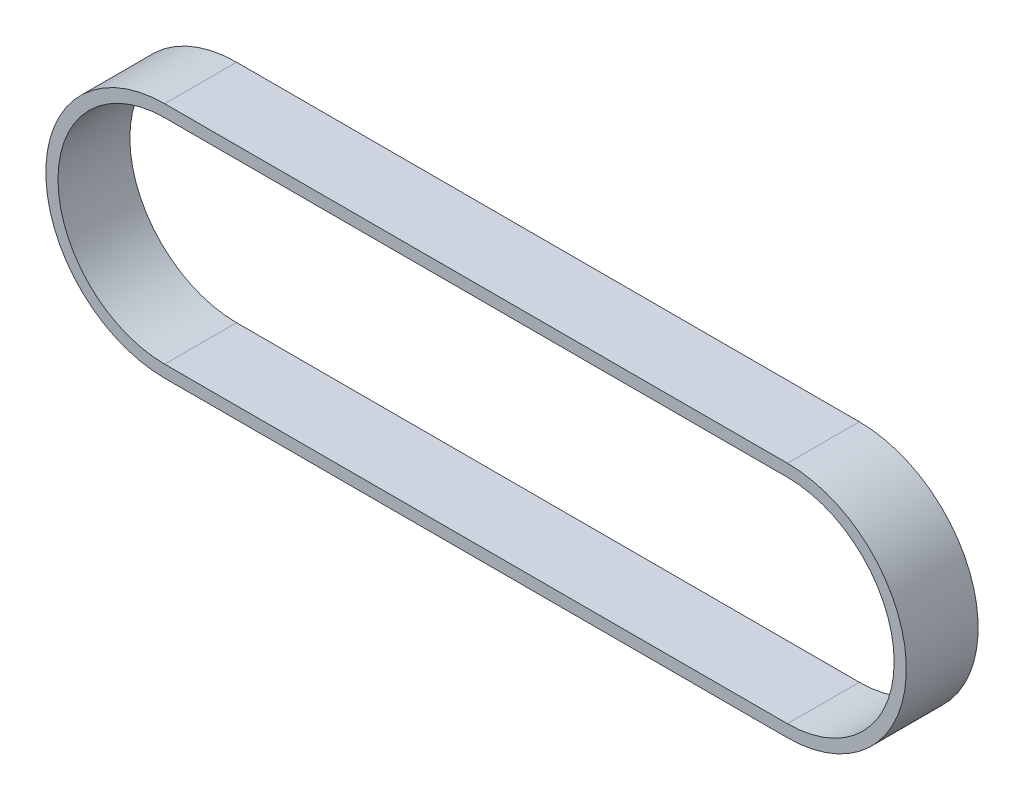
ISO-10303-21;
HEADER;
FILE_DESCRIPTION(('STEP AP214'),'2;1');
FILE_NAME('part.step','',(''),(''),'','','');
FILE_SCHEMA(('AUTOMOTIVE_DESIGN { 1 0 10303 214 1 1 1 1 }'));
ENDSEC;
DATA;
#1=APPLICATION_CONTEXT('core data for automotive mechanical design processes');
#2=APPLICATION_PROTOCOL_DEFINITION('international standard','automotive_design',2000,#1);
#3=PRODUCT_CONTEXT('',#1,'mechanical');
#4=PRODUCT('Part','Part','',(#3));
#5=PRODUCT_RELATED_PRODUCT_CATEGORY('part','',(#4));
#6=PRODUCT_DEFINITION_FORMATION('','',#4);
#7=PRODUCT_DEFINITION_CONTEXT('part definition',#1,'design');
#8=PRODUCT_DEFINITION('design','',#6,#7);
#9=PRODUCT_DEFINITION_SHAPE('','',#8);
#10=(LENGTH_UNIT() NAMED_UNIT(*) SI_UNIT(.MILLI.,.METRE.));
#11=(NAMED_UNIT(*) PLANE_ANGLE_UNIT() SI_UNIT($,.RADIAN.));
#12=(NAMED_UNIT(*) SI_UNIT($,.STERADIAN.) SOLID_ANGLE_UNIT());
#13=UNCERTAINTY_MEASURE_WITH_UNIT(LENGTH_MEASURE(1.E-05),#10,'distance_accuracy_value','');
#14=(GEOMETRIC_REPRESENTATION_CONTEXT(3) GLOBAL_UNCERTAINTY_ASSIGNED_CONTEXT((#13)) GLOBAL_UNIT_ASSIGNED_CONTEXT((#10,
#11,#12)) REPRESENTATION_CONTEXT('',''));
#15=CARTESIAN_POINT('',(0.,0.,0.));
#16=DIRECTION('',(0.,0.,1.));
#17=DIRECTION('',(1.,0.,0.));
#18=AXIS2_PLACEMENT_3D('',#15,#16,#17);
#19=CARTESIAN_POINT('',(0.,0.,15.));
#20=DIRECTION('',(0.,0.,-1.));
#21=DIRECTION('',(-1.,0.,0.));
#22=AXIS2_PLACEMENT_3D('',#19,#20,#21);
#23=PLANE('',#22);
#24=CARTESIAN_POINT('',(0.,0.,15.));
#25=DIRECTION('',(0.,0.,1.));
#26=DIRECTION('',(-1.,0.,0.));
#27=AXIS2_PLACEMENT_3D('',#24,#25,#26);
#28=CIRCLE('',#27,24.8158);
#29=CARTESIAN_POINT('',(0.,24.8158,15.));
#30=VERTEX_POINT('',#29);
#31=CARTESIAN_POINT('',(0.,-24.8158,15.));
#32=VERTEX_POINT('',#31);
#33=EDGE_CURVE('E140',#30,#32,#28,.T.);
#34=ORIENTED_EDGE('',*,*,#33,.T.);
#35=DIRECTION('',(1.,0.,0.));
#36=VECTOR('',#35,1.);
#37=CARTESIAN_POINT('',(129.9972,-24.8158,15.));
#38=LINE('',#37,#36);
#39=CARTESIAN_POINT('',(129.9972,-24.8158,15.));
#40=VERTEX_POINT('',#39);
#41=EDGE_CURVE('E143',#32,#40,#38,.T.);
#42=ORIENTED_EDGE('',*,*,#41,.T.);
#43=CARTESIAN_POINT('',(129.9972,0.,15.));
#44=DIRECTION('',(0.,0.,1.));
#45=DIRECTION('',(1.,0.,0.));
#46=AXIS2_PLACEMENT_3D('',#43,#44,#45);
#47=CIRCLE('',#46,24.8158);
#48=CARTESIAN_POINT('',(129.9972,24.8158,15.));
#49=VERTEX_POINT('',#48);
#50=EDGE_CURVE('E146',#40,#49,#47,.T.);
#51=ORIENTED_EDGE('',*,*,#50,.T.);
#52=DIRECTION('',(-1.,0.,0.));
#53=VECTOR('',#52,1.);
#54=CARTESIAN_POINT('',(0.,24.8158,15.));
#55=LINE('',#54,#53);
#56=EDGE_CURVE('E148',#49,#30,#55,.T.);
#57=ORIENTED_EDGE('',*,*,#56,.T.);
#58=EDGE_LOOP('',(#34,#42,#51,#57));
#59=FACE_BOUND('',#58,.T.);
#60=CARTESIAN_POINT('',(0.,0.,15.));
#61=DIRECTION('',(0.,0.,1.));
#62=DIRECTION('',(-1.,0.,0.));
#63=AXIS2_PLACEMENT_3D('',#60,#61,#62);
#64=CIRCLE('',#63,22.2758);
#65=CARTESIAN_POINT('',(0.,22.2758,15.));
#66=VERTEX_POINT('',#65);
#67=CARTESIAN_POINT('',(0.,-22.2758,15.));
#68=VERTEX_POINT('',#67);
#69=EDGE_CURVE('E104',#66,#68,#64,.T.);
#70=ORIENTED_EDGE('',*,*,#69,.F.);
#71=DIRECTION('',(-1.,0.,0.));
#72=VECTOR('',#71,1.);
#73=CARTESIAN_POINT('',(0.,22.2758,15.));
#74=LINE('',#73,#72);
#75=CARTESIAN_POINT('',(129.9972,22.2758,15.));
#76=VERTEX_POINT('',#75);
#77=EDGE_CURVE('E126',#76,#66,#74,.T.);
#78=ORIENTED_EDGE('',*,*,#77,.F.);
#79=CARTESIAN_POINT('',(129.9972,0.,15.));
#80=DIRECTION('',(0.,0.,1.));
#81=DIRECTION('',(1.,0.,0.));
#82=AXIS2_PLACEMENT_3D('',#79,#80,#81);
#83=CIRCLE('',#82,22.2758);
#84=CARTESIAN_POINT('',(129.9972,-22.2757999999999,15.));
#85=VERTEX_POINT('',#84);
#86=EDGE_CURVE('E124',#85,#76,#83,.T.);
#87=ORIENTED_EDGE('',*,*,#86,.F.);
#88=DIRECTION('',(1.,0.,0.));
#89=VECTOR('',#88,1.);
#90=CARTESIAN_POINT('',(129.9972,-22.2758,15.));
#91=LINE('',#90,#89);
#92=EDGE_CURVE('E112',#68,#85,#91,.T.);
#93=ORIENTED_EDGE('',*,*,#92,.F.);
#94=EDGE_LOOP('',(#70,#78,#87,#93));
#95=FACE_BOUND('',#94,.T.);
#96=ADVANCED_FACE('F39',(#59,#95),#23,.F.);
#97=CARTESIAN_POINT('',(0.,0.,0.));
#98=DIRECTION('',(0.,0.,-1.));
#99=DIRECTION('',(-1.,0.,0.));
#100=AXIS2_PLACEMENT_3D('',#97,#98,#99);
#101=PLANE('',#100);
#102=CARTESIAN_POINT('',(0.,0.,0.));
#103=DIRECTION('',(0.,0.,1.));
#104=DIRECTION('',(-1.,0.,0.));
#105=AXIS2_PLACEMENT_3D('',#102,#103,#104);
#106=CIRCLE('',#105,24.8158);
#107=CARTESIAN_POINT('',(0.,24.8158,0.));
#108=VERTEX_POINT('',#107);
#109=CARTESIAN_POINT('',(0.,-24.8158,0.));
#110=VERTEX_POINT('',#109);
#111=EDGE_CURVE('E120',#108,#110,#106,.T.);
#112=ORIENTED_EDGE('',*,*,#111,.F.);
#113=DIRECTION('',(-1.,0.,0.));
#114=VECTOR('',#113,1.);
#115=CARTESIAN_POINT('',(0.,24.8158,0.));
#116=LINE('',#115,#114);
#117=CARTESIAN_POINT('',(129.9972,24.8158,0.));
#118=VERTEX_POINT('',#117);
#119=EDGE_CURVE('E144',#118,#108,#116,.T.);
#120=ORIENTED_EDGE('',*,*,#119,.F.);
#121=CARTESIAN_POINT('',(129.9972,0.,0.));
#122=DIRECTION('',(0.,0.,1.));
#123=DIRECTION('',(1.,0.,0.));
#124=AXIS2_PLACEMENT_3D('',#121,#122,#123);
#125=CIRCLE('',#124,24.8158);
#126=CARTESIAN_POINT('',(129.9972,-24.8158,0.));
#127=VERTEX_POINT('',#126);
#128=EDGE_CURVE('E155',#127,#118,#125,.T.);
#129=ORIENTED_EDGE('',*,*,#128,.F.);
#130=DIRECTION('',(1.,0.,0.));
#131=VECTOR('',#130,1.);
#132=CARTESIAN_POINT('',(129.9972,-24.8158,0.));
#133=LINE('',#132,#131);
#134=EDGE_CURVE('E153',#110,#127,#133,.T.);
#135=ORIENTED_EDGE('',*,*,#134,.F.);
#136=EDGE_LOOP('',(#112,#120,#129,#135));
#137=FACE_BOUND('',#136,.T.);
#138=DIRECTION('',(-1.,0.,0.));
#139=VECTOR('',#138,1.);
#140=CARTESIAN_POINT('',(0.,22.2758,0.));
#141=LINE('',#140,#139);
#142=CARTESIAN_POINT('',(129.9972,22.2758,0.));
#143=VERTEX_POINT('',#142);
#144=CARTESIAN_POINT('',(0.,22.2758,0.));
#145=VERTEX_POINT('',#144);
#146=EDGE_CURVE('E113',#143,#145,#141,.T.);
#147=ORIENTED_EDGE('',*,*,#146,.T.);
#148=CARTESIAN_POINT('',(0.,0.,0.));
#149=DIRECTION('',(0.,0.,1.));
#150=DIRECTION('',(-1.,0.,0.));
#151=AXIS2_PLACEMENT_3D('',#148,#149,#150);
#152=CIRCLE('',#151,22.2758);
#153=CARTESIAN_POINT('',(0.,-22.2758,0.));
#154=VERTEX_POINT('',#153);
#155=EDGE_CURVE('E62',#145,#154,#152,.T.);
#156=ORIENTED_EDGE('',*,*,#155,.T.);
#157=DIRECTION('',(1.,0.,0.));
#158=VECTOR('',#157,1.);
#159=CARTESIAN_POINT('',(129.9972,-22.2758,0.));
#160=LINE('',#159,#158);
#161=CARTESIAN_POINT('',(129.9972,-22.2757999999999,0.));
#162=VERTEX_POINT('',#161);
#163=EDGE_CURVE('E119',#154,#162,#160,.T.);
#164=ORIENTED_EDGE('',*,*,#163,.T.);
#165=CARTESIAN_POINT('',(129.9972,0.,0.));
#166=DIRECTION('',(0.,0.,1.));
#167=DIRECTION('',(1.,0.,0.));
#168=AXIS2_PLACEMENT_3D('',#165,#166,#167);
#169=CIRCLE('',#168,22.2758);
#170=EDGE_CURVE('E132',#162,#143,#169,.T.);
#171=ORIENTED_EDGE('',*,*,#170,.T.);
#172=EDGE_LOOP('',(#147,#156,#164,#171));
#173=FACE_BOUND('',#172,.T.);
#174=ADVANCED_FACE('F173',(#137,#173),#101,.T.);
#175=CARTESIAN_POINT('',(0.,0.,15.));
#176=DIRECTION('',(0.,0.,-1.));
#177=DIRECTION('',(-1.,0.,0.));
#178=AXIS2_PLACEMENT_3D('',#175,#176,#177);
#179=CYLINDRICAL_SURFACE('',#178,24.8158);
#180=ORIENTED_EDGE('',*,*,#111,.T.);
#181=DIRECTION('',(0.,0.,-1.));
#182=VECTOR('',#181,1.);
#183=CARTESIAN_POINT('',(0.,-24.8158,15.));
#184=LINE('',#183,#182);
#185=EDGE_CURVE('E11',#32,#110,#184,.T.);
#186=ORIENTED_EDGE('',*,*,#185,.F.);
#187=ORIENTED_EDGE('',*,*,#33,.F.);
#188=DIRECTION('',(0.,0.,-1.));
#189=VECTOR('',#188,1.);
#190=CARTESIAN_POINT('',(0.,24.8158,15.));
#191=LINE('',#190,#189);
#192=EDGE_CURVE('E150',#30,#108,#191,.T.);
#193=ORIENTED_EDGE('',*,*,#192,.T.);
#194=EDGE_LOOP('',(#180,#186,#187,#193));
#195=FACE_BOUND('',#194,.T.);
#196=ADVANCED_FACE('F41',(#195),#179,.T.);
#197=CARTESIAN_POINT('',(129.9972,-24.8158,15.));
#198=DIRECTION('',(0.,1.,0.));
#199=DIRECTION('',(-1.,0.,0.));
#200=AXIS2_PLACEMENT_3D('',#197,#198,#199);
#201=PLANE('',#200);
#202=ORIENTED_EDGE('',*,*,#134,.T.);
#203=DIRECTION('',(0.,0.,-1.));
#204=VECTOR('',#203,1.);
#205=CARTESIAN_POINT('',(129.9972,-24.8158,15.));
#206=LINE('',#205,#204);
#207=EDGE_CURVE('E47',#40,#127,#206,.T.);
#208=ORIENTED_EDGE('',*,*,#207,.F.);
#209=ORIENTED_EDGE('',*,*,#41,.F.);
#210=ORIENTED_EDGE('',*,*,#185,.T.);
#211=EDGE_LOOP('',(#202,#208,#209,#210));
#212=FACE_BOUND('',#211,.T.);
#213=ADVANCED_FACE('F183',(#212),#201,.F.);
#214=CARTESIAN_POINT('',(129.9972,0.,15.));
#215=DIRECTION('',(0.,0.,-1.));
#216=DIRECTION('',(-1.,0.,0.));
#217=AXIS2_PLACEMENT_3D('',#214,#215,#216);
#218=CYLINDRICAL_SURFACE('',#217,24.8158);
#219=ORIENTED_EDGE('',*,*,#128,.T.);
#220=DIRECTION('',(0.,0.,-1.));
#221=VECTOR('',#220,1.);
#222=CARTESIAN_POINT('',(129.9972,24.8158,15.));
#223=LINE('',#222,#221);
#224=EDGE_CURVE('E160',#49,#118,#223,.T.);
#225=ORIENTED_EDGE('',*,*,#224,.F.);
#226=ORIENTED_EDGE('',*,*,#50,.F.);
#227=ORIENTED_EDGE('',*,*,#207,.T.);
#228=EDGE_LOOP('',(#219,#225,#226,#227));
#229=FACE_BOUND('',#228,.T.);
#230=ADVANCED_FACE('F167',(#229),#218,.T.);
#231=CARTESIAN_POINT('',(0.,24.8158,15.));
#232=DIRECTION('',(0.,-1.,0.));
#233=DIRECTION('',(1.,0.,0.));
#234=AXIS2_PLACEMENT_3D('',#231,#232,#233);
#235=PLANE('',#234);
#236=ORIENTED_EDGE('',*,*,#119,.T.);
#237=ORIENTED_EDGE('',*,*,#192,.F.);
#238=ORIENTED_EDGE('',*,*,#56,.F.);
#239=ORIENTED_EDGE('',*,*,#224,.T.);
#240=EDGE_LOOP('',(#236,#237,#238,#239));
#241=FACE_BOUND('',#240,.T.);
#242=ADVANCED_FACE('F177',(#241),#235,.F.);
#243=CARTESIAN_POINT('',(0.,0.,15.));
#244=DIRECTION('',(0.,0.,-1.));
#245=DIRECTION('',(-1.,0.,0.));
#246=AXIS2_PLACEMENT_3D('',#243,#244,#245);
#247=CYLINDRICAL_SURFACE('',#246,22.2758);
#248=ORIENTED_EDGE('',*,*,#155,.F.);
#249=DIRECTION('',(0.,0.,-1.));
#250=VECTOR('',#249,1.);
#251=CARTESIAN_POINT('',(0.,22.2758,15.));
#252=LINE('',#251,#250);
#253=EDGE_CURVE('E108',#66,#145,#252,.T.);
#254=ORIENTED_EDGE('',*,*,#253,.F.);
#255=ORIENTED_EDGE('',*,*,#69,.T.);
#256=DIRECTION('',(0.,0.,-1.));
#257=VECTOR('',#256,1.);
#258=CARTESIAN_POINT('',(0.,-22.2758,15.));
#259=LINE('',#258,#257);
#260=EDGE_CURVE('E107',#68,#154,#259,.T.);
#261=ORIENTED_EDGE('',*,*,#260,.T.);
#262=EDGE_LOOP('',(#248,#254,#255,#261));
#263=FACE_BOUND('',#262,.T.);
#264=ADVANCED_FACE('F106',(#263),#247,.F.);
#265=CARTESIAN_POINT('',(129.9972,-22.2758,15.));
#266=DIRECTION('',(0.,1.,0.));
#267=DIRECTION('',(-1.,0.,0.));
#268=AXIS2_PLACEMENT_3D('',#265,#266,#267);
#269=PLANE('',#268);
#270=ORIENTED_EDGE('',*,*,#163,.F.);
#271=ORIENTED_EDGE('',*,*,#260,.F.);
#272=ORIENTED_EDGE('',*,*,#92,.T.);
#273=DIRECTION('',(0.,0.,-1.));
#274=VECTOR('',#273,1.);
#275=CARTESIAN_POINT('',(129.9972,-22.2757999999999,15.));
#276=LINE('',#275,#274);
#277=EDGE_CURVE('E121',#85,#162,#276,.T.);
#278=ORIENTED_EDGE('',*,*,#277,.T.);
#279=EDGE_LOOP('',(#270,#271,#272,#278));
#280=FACE_BOUND('',#279,.T.);
#281=ADVANCED_FACE('F116',(#280),#269,.T.);
#282=CARTESIAN_POINT('',(129.9972,0.,15.));
#283=DIRECTION('',(0.,0.,-1.));
#284=DIRECTION('',(-1.,0.,0.));
#285=AXIS2_PLACEMENT_3D('',#282,#283,#284);
#286=CYLINDRICAL_SURFACE('',#285,22.2758);
#287=ORIENTED_EDGE('',*,*,#170,.F.);
#288=ORIENTED_EDGE('',*,*,#277,.F.);
#289=ORIENTED_EDGE('',*,*,#86,.T.);
#290=DIRECTION('',(0.,0.,-1.));
#291=VECTOR('',#290,1.);
#292=CARTESIAN_POINT('',(129.9972,22.2758,15.));
#293=LINE('',#292,#291);
#294=EDGE_CURVE('E54',#76,#143,#293,.T.);
#295=ORIENTED_EDGE('',*,*,#294,.T.);
#296=EDGE_LOOP('',(#287,#288,#289,#295));
#297=FACE_BOUND('',#296,.T.);
#298=ADVANCED_FACE('F206',(#297),#286,.F.);
#299=CARTESIAN_POINT('',(0.,22.2758,15.));
#300=DIRECTION('',(0.,-1.,0.));
#301=DIRECTION('',(1.,0.,0.));
#302=AXIS2_PLACEMENT_3D('',#299,#300,#301);
#303=PLANE('',#302);
#304=ORIENTED_EDGE('',*,*,#146,.F.);
#305=ORIENTED_EDGE('',*,*,#294,.F.);
#306=ORIENTED_EDGE('',*,*,#77,.T.);
#307=ORIENTED_EDGE('',*,*,#253,.T.);
#308=EDGE_LOOP('',(#304,#305,#306,#307));
#309=FACE_BOUND('',#308,.T.);
#310=ADVANCED_FACE('F210',(#309),#303,.T.);
#311=CLOSED_SHELL('',(#96,#174,#196,#213,#230,#242,#264,#281,#298,#310));
#312=MANIFOLD_SOLID_BREP('B2',#311);
#313=ADVANCED_BREP_SHAPE_REPRESENTATION('',(#18,#312),#14);
#314=SHAPE_DEFINITION_REPRESENTATION(#9,#313);
ENDSEC;
END-ISO-10303-21;
